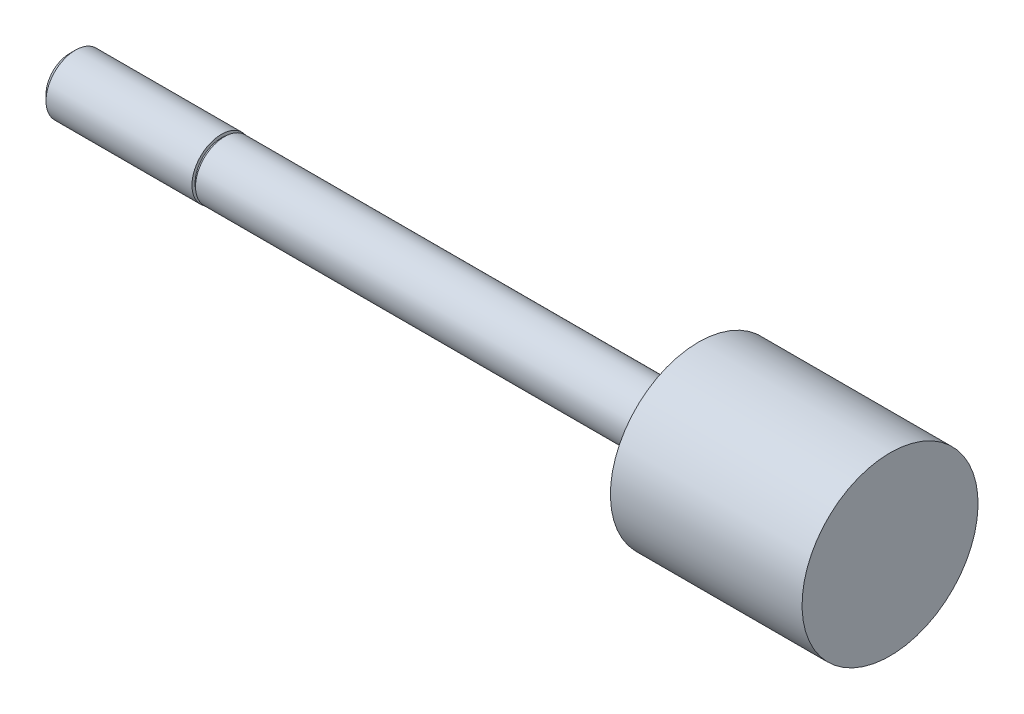
ISO-10303-21;
HEADER;
FILE_DESCRIPTION(('STEP AP214'),'2;1');
FILE_NAME('part.step','',(''),(''),'','','');
FILE_SCHEMA(('AUTOMOTIVE_DESIGN { 1 0 10303 214 1 1 1 1 }'));
ENDSEC;
DATA;
#1=APPLICATION_CONTEXT('core data for automotive mechanical design processes');
#2=APPLICATION_PROTOCOL_DEFINITION('international standard','automotive_design',2000,#1);
#3=PRODUCT_CONTEXT('',#1,'mechanical');
#4=PRODUCT('Part','Part','',(#3));
#5=PRODUCT_RELATED_PRODUCT_CATEGORY('part','',(#4));
#6=PRODUCT_DEFINITION_FORMATION('','',#4);
#7=PRODUCT_DEFINITION_CONTEXT('part definition',#1,'design');
#8=PRODUCT_DEFINITION('design','',#6,#7);
#9=PRODUCT_DEFINITION_SHAPE('','',#8);
#10=(LENGTH_UNIT() NAMED_UNIT(*) SI_UNIT(.MILLI.,.METRE.));
#11=(NAMED_UNIT(*) PLANE_ANGLE_UNIT() SI_UNIT($,.RADIAN.));
#12=(NAMED_UNIT(*) SI_UNIT($,.STERADIAN.) SOLID_ANGLE_UNIT());
#13=UNCERTAINTY_MEASURE_WITH_UNIT(LENGTH_MEASURE(1.E-05),#10,'distance_accuracy_value','');
#14=(GEOMETRIC_REPRESENTATION_CONTEXT(3) GLOBAL_UNCERTAINTY_ASSIGNED_CONTEXT((#13)) GLOBAL_UNIT_ASSIGNED_CONTEXT((#10,
#11,#12)) REPRESENTATION_CONTEXT('',''));
#15=CARTESIAN_POINT('',(0.,0.,0.));
#16=DIRECTION('',(0.,0.,1.));
#17=DIRECTION('',(1.,0.,0.));
#18=AXIS2_PLACEMENT_3D('',#15,#16,#17);
#19=CARTESIAN_POINT('',(-12.7,-1.96384672,-1.96384672));
#20=DIRECTION('',(-1.,0.,0.));
#21=DIRECTION('',(0.,0.,1.));
#22=AXIS2_PLACEMENT_3D('',#19,#20,#21);
#23=PLANE('',#22);
#24=CARTESIAN_POINT('',(-12.6999999999384,0.,0.));
#25=DIRECTION('',(1.,0.,0.));
#26=DIRECTION('',(0.,1.,0.));
#27=AXIS2_PLACEMENT_3D('',#24,#25,#26);
#28=CIRCLE('',#27,1.94055999998);
#29=CARTESIAN_POINT('',(-12.6999999999384,1.94055999998,0.));
#30=VERTEX_POINT('',#29);
#31=EDGE_CURVE('E18',#30,#30,#28,.T.);
#32=ORIENTED_EDGE('',*,*,#31,.F.);
#33=EDGE_LOOP('',(#32));
#34=FACE_BOUND('',#33,.T.);
#35=ADVANCED_FACE('F15',(#34),#23,.T.);
#36=CARTESIAN_POINT('',(-12.2275599999853,0.,0.));
#37=DIRECTION('',(1.,0.,0.));
#38=DIRECTION('',(0.,1.,0.));
#39=AXIS2_PLACEMENT_3D('',#36,#37,#38);
#40=CONICAL_SURFACE('',#39,2.41299999999001,0.785398163457608);
#41=ORIENTED_EDGE('',*,*,#31,.T.);
#42=EDGE_LOOP('',(#41));
#43=FACE_BOUND('',#42,.T.);
#44=CARTESIAN_POINT('',(-12.22756,0.,0.));
#45=DIRECTION('',(1.,0.,0.));
#46=DIRECTION('',(0.,0.,-1.));
#47=AXIS2_PLACEMENT_3D('',#44,#45,#46);
#48=CIRCLE('',#47,2.413);
#49=CARTESIAN_POINT('',(-12.22756,0.,-2.413));
#50=VERTEX_POINT('',#49);
#51=EDGE_CURVE('E30',#50,#50,#48,.T.);
#52=ORIENTED_EDGE('',*,*,#51,.F.);
#53=EDGE_LOOP('',(#52));
#54=FACE_BOUND('',#53,.T.);
#55=ADVANCED_FACE('F52',(#43,#54),#40,.T.);
#56=CARTESIAN_POINT('',(-0.254,0.,0.));
#57=DIRECTION('',(1.,0.,0.));
#58=DIRECTION('',(0.,0.,-1.));
#59=AXIS2_PLACEMENT_3D('',#56,#57,#58);
#60=CYLINDRICAL_SURFACE('',#59,2.413);
#61=ORIENTED_EDGE('',*,*,#51,.T.);
#62=EDGE_LOOP('',(#61));
#63=FACE_BOUND('',#62,.T.);
#64=CARTESIAN_POINT('',(-0.254,0.,0.));
#65=DIRECTION('',(1.,0.,0.));
#66=DIRECTION('',(0.,0.,-1.));
#67=AXIS2_PLACEMENT_3D('',#64,#65,#66);
#68=CIRCLE('',#67,2.413);
#69=CARTESIAN_POINT('',(-0.254,0.,-2.413));
#70=VERTEX_POINT('',#69);
#71=EDGE_CURVE('E42',#70,#70,#68,.T.);
#72=ORIENTED_EDGE('',*,*,#71,.F.);
#73=EDGE_LOOP('',(#72));
#74=FACE_BOUND('',#73,.T.);
#75=ADVANCED_FACE('F60',(#63,#74),#60,.T.);
#76=CARTESIAN_POINT('',(-0.254,-2.441956,2.441956));
#77=DIRECTION('',(1.,0.,0.));
#78=DIRECTION('',(0.,0.,-1.));
#79=AXIS2_PLACEMENT_3D('',#76,#77,#78);
#80=PLANE('',#79);
#81=ORIENTED_EDGE('',*,*,#71,.T.);
#82=EDGE_LOOP('',(#81));
#83=FACE_BOUND('',#82,.T.);
#84=CARTESIAN_POINT('',(-0.254,0.,0.));
#85=DIRECTION('',(1.,0.,0.));
#86=DIRECTION('',(0.,0.,-1.));
#87=AXIS2_PLACEMENT_3D('',#84,#85,#86);
#88=CIRCLE('',#87,2.159);
#89=CARTESIAN_POINT('',(-0.254,0.,-2.159));
#90=VERTEX_POINT('',#89);
#91=EDGE_CURVE('E40',#90,#90,#88,.T.);
#92=ORIENTED_EDGE('',*,*,#91,.F.);
#93=EDGE_LOOP('',(#92));
#94=FACE_BOUND('',#93,.T.);
#95=ADVANCED_FACE('F87',(#83,#94),#80,.T.);
#96=CARTESIAN_POINT('',(0.,0.,0.));
#97=DIRECTION('',(1.,0.,0.));
#98=DIRECTION('',(0.,0.,-1.));
#99=AXIS2_PLACEMENT_3D('',#96,#97,#98);
#100=CYLINDRICAL_SURFACE('',#99,2.159);
#101=ORIENTED_EDGE('',*,*,#91,.T.);
#102=EDGE_LOOP('',(#101));
#103=FACE_BOUND('',#102,.T.);
#104=CARTESIAN_POINT('',(0.,0.,0.));
#105=DIRECTION('',(1.,0.,0.));
#106=DIRECTION('',(0.,0.,-1.));
#107=AXIS2_PLACEMENT_3D('',#104,#105,#106);
#108=CIRCLE('',#107,2.159);
#109=CARTESIAN_POINT('',(0.,0.,-2.159));
#110=VERTEX_POINT('',#109);
#111=EDGE_CURVE('E37',#110,#110,#108,.T.);
#112=ORIENTED_EDGE('',*,*,#111,.F.);
#113=EDGE_LOOP('',(#112));
#114=FACE_BOUND('',#113,.T.);
#115=ADVANCED_FACE('F83',(#103,#114),#100,.T.);
#116=CARTESIAN_POINT('',(0.,-2.4033988,-2.4033988));
#117=DIRECTION('',(-1.,0.,0.));
#118=DIRECTION('',(0.,0.,1.));
#119=AXIS2_PLACEMENT_3D('',#116,#117,#118);
#120=PLANE('',#119);
#121=CARTESIAN_POINT('',(0.,0.,0.));
#122=DIRECTION('',(1.,0.,0.));
#123=DIRECTION('',(0.,0.,-1.));
#124=AXIS2_PLACEMENT_3D('',#121,#122,#123);
#125=CIRCLE('',#124,2.3749);
#126=CARTESIAN_POINT('',(0.,0.,-2.3749));
#127=VERTEX_POINT('',#126);
#128=EDGE_CURVE('E34',#127,#127,#125,.T.);
#129=ORIENTED_EDGE('',*,*,#128,.F.);
#130=EDGE_LOOP('',(#129));
#131=FACE_BOUND('',#130,.T.);
#132=ORIENTED_EDGE('',*,*,#111,.T.);
#133=EDGE_LOOP('',(#132));
#134=FACE_BOUND('',#133,.T.);
#135=ADVANCED_FACE('F79',(#131,#134),#120,.T.);
#136=CARTESIAN_POINT('',(38.8874,0.,0.));
#137=DIRECTION('',(1.,0.,0.));
#138=DIRECTION('',(0.,0.,-1.));
#139=AXIS2_PLACEMENT_3D('',#136,#137,#138);
#140=CYLINDRICAL_SURFACE('',#139,2.3749);
#141=CARTESIAN_POINT('',(38.8874,0.,0.));
#142=DIRECTION('',(1.,0.,0.));
#143=DIRECTION('',(0.,0.,-1.));
#144=AXIS2_PLACEMENT_3D('',#141,#142,#143);
#145=CIRCLE('',#144,2.3749);
#146=CARTESIAN_POINT('',(38.8874,0.,-2.3749));
#147=VERTEX_POINT('',#146);
#148=EDGE_CURVE('E27',#147,#147,#145,.T.);
#149=ORIENTED_EDGE('',*,*,#148,.F.);
#150=EDGE_LOOP('',(#149));
#151=FACE_BOUND('',#150,.T.);
#152=ORIENTED_EDGE('',*,*,#128,.T.);
#153=EDGE_LOOP('',(#152));
#154=FACE_BOUND('',#153,.T.);
#155=ADVANCED_FACE('F75',(#151,#154),#140,.T.);
#156=CARTESIAN_POINT('',(38.8874,-7.30658940000001,-7.3065894));
#157=DIRECTION('',(-1.,0.,0.));
#158=DIRECTION('',(0.,0.,1.));
#159=AXIS2_PLACEMENT_3D('',#156,#157,#158);
#160=PLANE('',#159);
#161=CARTESIAN_POINT('',(38.8874,0.,0.));
#162=DIRECTION('',(1.,0.,0.));
#163=DIRECTION('',(0.,1.,0.));
#164=AXIS2_PLACEMENT_3D('',#161,#162,#163);
#165=CIRCLE('',#164,7.21995);
#166=CARTESIAN_POINT('',(38.8874,7.21994999999999,0.));
#167=VERTEX_POINT('',#166);
#168=EDGE_CURVE('E22',#167,#167,#165,.T.);
#169=ORIENTED_EDGE('',*,*,#168,.F.);
#170=EDGE_LOOP('',(#169));
#171=FACE_BOUND('',#170,.T.);
#172=ORIENTED_EDGE('',*,*,#148,.T.);
#173=EDGE_LOOP('',(#172));
#174=FACE_BOUND('',#173,.T.);
#175=ADVANCED_FACE('F69',(#171,#174),#160,.T.);
#176=CARTESIAN_POINT('',(54.61,-7.30658940000001,7.3065894));
#177=DIRECTION('',(1.,0.,0.));
#178=DIRECTION('',(0.,0.,-1.));
#179=AXIS2_PLACEMENT_3D('',#176,#177,#178);
#180=PLANE('',#179);
#181=CARTESIAN_POINT('',(54.61,0.,0.));
#182=DIRECTION('',(1.,0.,0.));
#183=DIRECTION('',(0.,1.,0.));
#184=AXIS2_PLACEMENT_3D('',#181,#182,#183);
#185=CIRCLE('',#184,7.21995);
#186=CARTESIAN_POINT('',(54.61,7.21995,0.));
#187=VERTEX_POINT('',#186);
#188=EDGE_CURVE('E10',#187,#187,#185,.F.);
#189=ORIENTED_EDGE('',*,*,#188,.F.);
#190=EDGE_LOOP('',(#189));
#191=FACE_BOUND('',#190,.T.);
#192=ADVANCED_FACE('F63',(#191),#180,.T.);
#193=CARTESIAN_POINT('',(54.61,0.,0.));
#194=DIRECTION('',(1.,0.,0.));
#195=DIRECTION('',(0.,1.,0.));
#196=AXIS2_PLACEMENT_3D('',#193,#194,#195);
#197=CYLINDRICAL_SURFACE('',#196,7.21995);
#198=ORIENTED_EDGE('',*,*,#168,.T.);
#199=EDGE_LOOP('',(#198));
#200=FACE_BOUND('',#199,.T.);
#201=ORIENTED_EDGE('',*,*,#188,.T.);
#202=EDGE_LOOP('',(#201));
#203=FACE_BOUND('',#202,.T.);
#204=ADVANCED_FACE('F61',(#200,#203),#197,.T.);
#205=CLOSED_SHELL('',(#35,#55,#75,#95,#115,#135,#155,#175,#192,#204));
#206=MANIFOLD_SOLID_BREP('B1',#205);
#207=ADVANCED_BREP_SHAPE_REPRESENTATION('',(#18,#206),#14);
#208=SHAPE_DEFINITION_REPRESENTATION(#9,#207);
ENDSEC;
END-ISO-10303-21;
